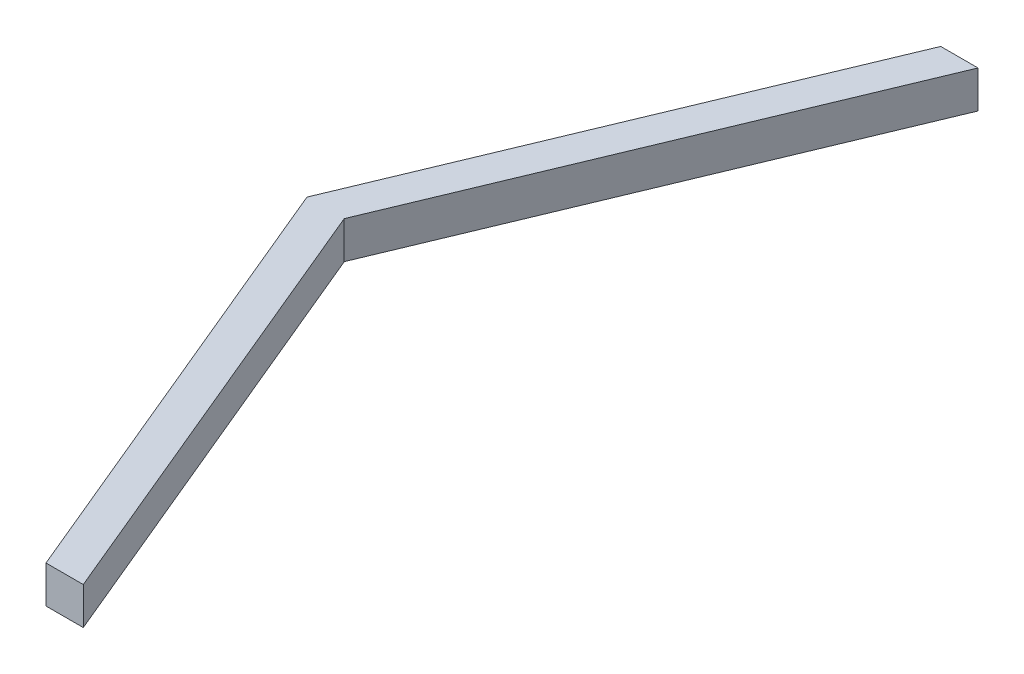
ISO-10303-21;
HEADER;
FILE_DESCRIPTION(('STEP AP214'),'2;1');
FILE_NAME('part.step','',(''),(''),'','','');
FILE_SCHEMA(('AUTOMOTIVE_DESIGN { 1 0 10303 214 1 1 1 1 }'));
ENDSEC;
DATA;
#1=APPLICATION_CONTEXT('core data for automotive mechanical design processes');
#2=APPLICATION_PROTOCOL_DEFINITION('international standard','automotive_design',2000,#1);
#3=PRODUCT_CONTEXT('',#1,'mechanical');
#4=PRODUCT('Part','Part','',(#3));
#5=PRODUCT_RELATED_PRODUCT_CATEGORY('part','',(#4));
#6=PRODUCT_DEFINITION_FORMATION('','',#4);
#7=PRODUCT_DEFINITION_CONTEXT('part definition',#1,'design');
#8=PRODUCT_DEFINITION('design','',#6,#7);
#9=PRODUCT_DEFINITION_SHAPE('','',#8);
#10=(LENGTH_UNIT() NAMED_UNIT(*) SI_UNIT(.MILLI.,.METRE.));
#11=(NAMED_UNIT(*) PLANE_ANGLE_UNIT() SI_UNIT($,.RADIAN.));
#12=(NAMED_UNIT(*) SI_UNIT($,.STERADIAN.) SOLID_ANGLE_UNIT());
#13=UNCERTAINTY_MEASURE_WITH_UNIT(LENGTH_MEASURE(1.E-05),#10,'distance_accuracy_value','');
#14=(GEOMETRIC_REPRESENTATION_CONTEXT(3) GLOBAL_UNCERTAINTY_ASSIGNED_CONTEXT((#13)) GLOBAL_UNIT_ASSIGNED_CONTEXT((#10,
#11,#12)) REPRESENTATION_CONTEXT('',''));
#15=CARTESIAN_POINT('',(0.,0.,0.));
#16=DIRECTION('',(0.,0.,1.));
#17=DIRECTION('',(1.,0.,0.));
#18=AXIS2_PLACEMENT_3D('',#15,#16,#17);
#19=CARTESIAN_POINT('',(-127.,25.4,0.));
#20=DIRECTION('',(-0.923076923076923,0.,-0.384615384615384));
#21=DIRECTION('',(-0.384615384615384,0.,0.923076923076923));
#22=AXIS2_PLACEMENT_3D('',#19,#20,#21);
#23=PLANE('',#22);
#24=DIRECTION('',(0.384615384615384,0.,-0.923076923076923));
#25=VECTOR('',#24,1.);
#26=CARTESIAN_POINT('',(-127.,0.,0.));
#27=LINE('',#26,#25);
#28=CARTESIAN_POINT('',(-127.,0.,0.));
#29=VERTEX_POINT('',#28);
#30=CARTESIAN_POINT('',(-1.12370528672763E-13,0.,-304.8));
#31=VERTEX_POINT('',#30);
#32=EDGE_CURVE('E117',#29,#31,#27,.T.);
#33=ORIENTED_EDGE('',*,*,#32,.T.);
#34=DIRECTION('',(0.,-1.,0.));
#35=VECTOR('',#34,1.);
#36=CARTESIAN_POINT('',(-1.12370528672763E-13,25.4,-304.8));
#37=LINE('',#36,#35);
#38=CARTESIAN_POINT('',(-1.12370528672763E-13,25.4,-304.8));
#39=VERTEX_POINT('',#38);
#40=EDGE_CURVE('E11',#39,#31,#37,.T.);
#41=ORIENTED_EDGE('',*,*,#40,.F.);
#42=DIRECTION('',(0.384615384615384,0.,-0.923076923076923));
#43=VECTOR('',#42,1.);
#44=CARTESIAN_POINT('',(-127.,25.4,0.));
#45=LINE('',#44,#43);
#46=CARTESIAN_POINT('',(-127.,25.4,0.));
#47=VERTEX_POINT('',#46);
#48=EDGE_CURVE('E127',#47,#39,#45,.T.);
#49=ORIENTED_EDGE('',*,*,#48,.F.);
#50=DIRECTION('',(0.,-1.,0.));
#51=VECTOR('',#50,1.);
#52=CARTESIAN_POINT('',(-127.,25.4,0.));
#53=LINE('',#52,#51);
#54=EDGE_CURVE('E113',#47,#29,#53,.T.);
#55=ORIENTED_EDGE('',*,*,#54,.T.);
#56=EDGE_LOOP('',(#33,#41,#49,#55));
#57=FACE_BOUND('',#56,.T.);
#58=ADVANCED_FACE('F33',(#57),#23,.F.);
#59=CARTESIAN_POINT('',(-1.12370528672763E-13,25.4,-304.8));
#60=DIRECTION('',(0.,0.,1.));
#61=DIRECTION('',(1.,0.,0.));
#62=AXIS2_PLACEMENT_3D('',#59,#60,#61);
#63=PLANE('',#62);
#64=DIRECTION('',(-1.,0.,0.));
#65=VECTOR('',#64,1.);
#66=CARTESIAN_POINT('',(-1.12370528672763E-13,0.,-304.8));
#67=LINE('',#66,#65);
#68=CARTESIAN_POINT('',(-25.4000000000001,0.,-304.8));
#69=VERTEX_POINT('',#68);
#70=EDGE_CURVE('E120',#31,#69,#67,.T.);
#71=ORIENTED_EDGE('',*,*,#70,.T.);
#72=DIRECTION('',(0.,-1.,0.));
#73=VECTOR('',#72,1.);
#74=CARTESIAN_POINT('',(-25.4000000000001,25.4,-304.8));
#75=LINE('',#74,#73);
#76=CARTESIAN_POINT('',(-25.4000000000001,25.4,-304.8));
#77=VERTEX_POINT('',#76);
#78=EDGE_CURVE('E41',#77,#69,#75,.T.);
#79=ORIENTED_EDGE('',*,*,#78,.F.);
#80=DIRECTION('',(-1.,0.,0.));
#81=VECTOR('',#80,1.);
#82=CARTESIAN_POINT('',(-1.12370528672763E-13,25.4,-304.8));
#83=LINE('',#82,#81);
#84=EDGE_CURVE('E86',#39,#77,#83,.T.);
#85=ORIENTED_EDGE('',*,*,#84,.F.);
#86=ORIENTED_EDGE('',*,*,#40,.T.);
#87=EDGE_LOOP('',(#71,#79,#85,#86));
#88=FACE_BOUND('',#87,.T.);
#89=ADVANCED_FACE('F151',(#88),#63,.F.);
#90=CARTESIAN_POINT('',(-25.4000000000001,25.4,-304.8));
#91=DIRECTION('',(0.923076923076923,0.,0.384615384615384));
#92=DIRECTION('',(0.384615384615384,0.,-0.923076923076923));
#93=AXIS2_PLACEMENT_3D('',#90,#91,#92);
#94=PLANE('',#93);
#95=DIRECTION('',(-0.384615384615384,0.,0.923076923076923));
#96=VECTOR('',#95,1.);
#97=CARTESIAN_POINT('',(-25.4000000000001,0.,-304.8));
#98=LINE('',#97,#96);
#99=CARTESIAN_POINT('',(-152.4,0.,0.));
#100=VERTEX_POINT('',#99);
#101=EDGE_CURVE('E122',#69,#100,#98,.T.);
#102=ORIENTED_EDGE('',*,*,#101,.T.);
#103=DIRECTION('',(0.,-1.,0.));
#104=VECTOR('',#103,1.);
#105=CARTESIAN_POINT('',(-152.4,25.4,0.));
#106=LINE('',#105,#104);
#107=CARTESIAN_POINT('',(-152.4,25.4,0.));
#108=VERTEX_POINT('',#107);
#109=EDGE_CURVE('E108',#108,#100,#106,.T.);
#110=ORIENTED_EDGE('',*,*,#109,.F.);
#111=DIRECTION('',(-0.384615384615384,0.,0.923076923076923));
#112=VECTOR('',#111,1.);
#113=CARTESIAN_POINT('',(-25.4000000000001,25.4,-304.8));
#114=LINE('',#113,#112);
#115=EDGE_CURVE('E99',#77,#108,#114,.T.);
#116=ORIENTED_EDGE('',*,*,#115,.F.);
#117=ORIENTED_EDGE('',*,*,#78,.T.);
#118=EDGE_LOOP('',(#102,#110,#116,#117));
#119=FACE_BOUND('',#118,.T.);
#120=ADVANCED_FACE('F133',(#119),#94,.F.);
#121=CARTESIAN_POINT('',(-152.4,25.4,0.));
#122=DIRECTION('',(0.923076923076923,0.,-0.384615384615385));
#123=DIRECTION('',(-0.384615384615385,0.,-0.923076923076923));
#124=AXIS2_PLACEMENT_3D('',#121,#122,#123);
#125=PLANE('',#124);
#126=DIRECTION('',(0.384615384615385,0.,0.923076923076923));
#127=VECTOR('',#126,1.);
#128=CARTESIAN_POINT('',(-152.4,0.,0.));
#129=LINE('',#128,#127);
#130=CARTESIAN_POINT('',(-25.3999999999999,0.,304.8));
#131=VERTEX_POINT('',#130);
#132=EDGE_CURVE('E107',#100,#131,#129,.T.);
#133=ORIENTED_EDGE('',*,*,#132,.T.);
#134=DIRECTION('',(0.,-1.,0.));
#135=VECTOR('',#134,1.);
#136=CARTESIAN_POINT('',(-25.3999999999999,25.4,304.8));
#137=LINE('',#136,#135);
#138=CARTESIAN_POINT('',(-25.3999999999999,25.4,304.8));
#139=VERTEX_POINT('',#138);
#140=EDGE_CURVE('E104',#139,#131,#137,.T.);
#141=ORIENTED_EDGE('',*,*,#140,.F.);
#142=DIRECTION('',(0.384615384615385,0.,0.923076923076923));
#143=VECTOR('',#142,1.);
#144=CARTESIAN_POINT('',(-152.4,25.4,0.));
#145=LINE('',#144,#143);
#146=EDGE_CURVE('E93',#108,#139,#145,.T.);
#147=ORIENTED_EDGE('',*,*,#146,.F.);
#148=ORIENTED_EDGE('',*,*,#109,.T.);
#149=EDGE_LOOP('',(#133,#141,#147,#148));
#150=FACE_BOUND('',#149,.T.);
#151=ADVANCED_FACE('F105',(#150),#125,.F.);
#152=CARTESIAN_POINT('',(-25.3999999999999,25.4,304.8));
#153=DIRECTION('',(0.,0.,-1.));
#154=DIRECTION('',(-1.,0.,0.));
#155=AXIS2_PLACEMENT_3D('',#152,#153,#154);
#156=PLANE('',#155);
#157=DIRECTION('',(1.,0.,0.));
#158=VECTOR('',#157,1.);
#159=CARTESIAN_POINT('',(-25.3999999999999,0.,304.8));
#160=LINE('',#159,#158);
#161=CARTESIAN_POINT('',(0.,0.,304.8));
#162=VERTEX_POINT('',#161);
#163=EDGE_CURVE('E72',#131,#162,#160,.T.);
#164=ORIENTED_EDGE('',*,*,#163,.T.);
#165=DIRECTION('',(0.,-1.,0.));
#166=VECTOR('',#165,1.);
#167=CARTESIAN_POINT('',(0.,25.4,304.8));
#168=LINE('',#167,#166);
#169=CARTESIAN_POINT('',(0.,25.4,304.8));
#170=VERTEX_POINT('',#169);
#171=EDGE_CURVE('E109',#170,#162,#168,.T.);
#172=ORIENTED_EDGE('',*,*,#171,.F.);
#173=DIRECTION('',(1.,0.,0.));
#174=VECTOR('',#173,1.);
#175=CARTESIAN_POINT('',(-25.3999999999999,25.4,304.8));
#176=LINE('',#175,#174);
#177=EDGE_CURVE('E97',#139,#170,#176,.T.);
#178=ORIENTED_EDGE('',*,*,#177,.F.);
#179=ORIENTED_EDGE('',*,*,#140,.T.);
#180=EDGE_LOOP('',(#164,#172,#178,#179));
#181=FACE_BOUND('',#180,.T.);
#182=ADVANCED_FACE('F111',(#181),#156,.F.);
#183=CARTESIAN_POINT('',(0.,25.4,304.8));
#184=DIRECTION('',(-0.923076923076923,0.,0.384615384615385));
#185=DIRECTION('',(0.384615384615385,0.,0.923076923076923));
#186=AXIS2_PLACEMENT_3D('',#183,#184,#185);
#187=PLANE('',#186);
#188=DIRECTION('',(-0.384615384615385,0.,-0.923076923076923));
#189=VECTOR('',#188,1.);
#190=CARTESIAN_POINT('',(0.,0.,304.8));
#191=LINE('',#190,#189);
#192=EDGE_CURVE('E78',#162,#29,#191,.T.);
#193=ORIENTED_EDGE('',*,*,#192,.T.);
#194=ORIENTED_EDGE('',*,*,#54,.F.);
#195=DIRECTION('',(-0.384615384615385,0.,-0.923076923076923));
#196=VECTOR('',#195,1.);
#197=CARTESIAN_POINT('',(0.,25.4,304.8));
#198=LINE('',#197,#196);
#199=EDGE_CURVE('E49',#170,#47,#198,.T.);
#200=ORIENTED_EDGE('',*,*,#199,.F.);
#201=ORIENTED_EDGE('',*,*,#171,.T.);
#202=EDGE_LOOP('',(#193,#194,#200,#201));
#203=FACE_BOUND('',#202,.T.);
#204=ADVANCED_FACE('F140',(#203),#187,.F.);
#205=CARTESIAN_POINT('',(0.,25.4,0.));
#206=DIRECTION('',(0.,1.,0.));
#207=DIRECTION('',(0.,0.,1.));
#208=AXIS2_PLACEMENT_3D('',#205,#206,#207);
#209=PLANE('',#208);
#210=ORIENTED_EDGE('',*,*,#48,.T.);
#211=ORIENTED_EDGE('',*,*,#84,.T.);
#212=ORIENTED_EDGE('',*,*,#115,.T.);
#213=ORIENTED_EDGE('',*,*,#146,.T.);
#214=ORIENTED_EDGE('',*,*,#177,.T.);
#215=ORIENTED_EDGE('',*,*,#199,.T.);
#216=EDGE_LOOP('',(#210,#211,#212,#213,#214,#215));
#217=FACE_BOUND('',#216,.T.);
#218=ADVANCED_FACE('F95',(#217),#209,.T.);
#219=CARTESIAN_POINT('',(0.,0.,0.));
#220=DIRECTION('',(0.,1.,0.));
#221=DIRECTION('',(0.,0.,1.));
#222=AXIS2_PLACEMENT_3D('',#219,#220,#221);
#223=PLANE('',#222);
#224=ORIENTED_EDGE('',*,*,#32,.F.);
#225=ORIENTED_EDGE('',*,*,#192,.F.);
#226=ORIENTED_EDGE('',*,*,#163,.F.);
#227=ORIENTED_EDGE('',*,*,#132,.F.);
#228=ORIENTED_EDGE('',*,*,#101,.F.);
#229=ORIENTED_EDGE('',*,*,#70,.F.);
#230=EDGE_LOOP('',(#224,#225,#226,#227,#228,#229));
#231=FACE_BOUND('',#230,.T.);
#232=ADVANCED_FACE('F136',(#231),#223,.F.);
#233=CLOSED_SHELL('',(#58,#89,#120,#151,#182,#204,#218,#232));
#234=MANIFOLD_SOLID_BREP('B2',#233);
#235=ADVANCED_BREP_SHAPE_REPRESENTATION('',(#18,#234),#14);
#236=SHAPE_DEFINITION_REPRESENTATION(#9,#235);
ENDSEC;
END-ISO-10303-21;
